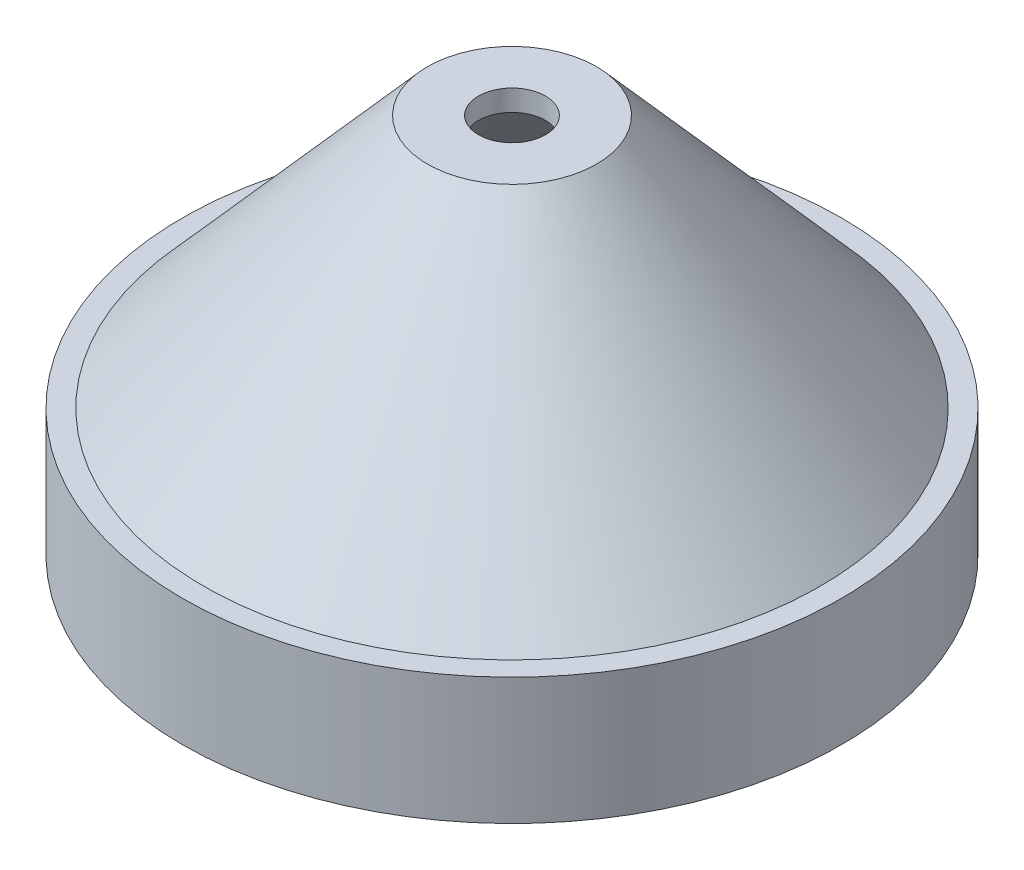
ISO-10303-21;
HEADER;
FILE_DESCRIPTION(('STEP AP214'),'2;1');
FILE_NAME('part.step','',(''),(''),'','','');
FILE_SCHEMA(('AUTOMOTIVE_DESIGN { 1 0 10303 214 1 1 1 1 }'));
ENDSEC;
DATA;
#1=APPLICATION_CONTEXT('core data for automotive mechanical design processes');
#2=APPLICATION_PROTOCOL_DEFINITION('international standard','automotive_design',2000,#1);
#3=PRODUCT_CONTEXT('',#1,'mechanical');
#4=PRODUCT('Part','Part','',(#3));
#5=PRODUCT_RELATED_PRODUCT_CATEGORY('part','',(#4));
#6=PRODUCT_DEFINITION_FORMATION('','',#4);
#7=PRODUCT_DEFINITION_CONTEXT('part definition',#1,'design');
#8=PRODUCT_DEFINITION('design','',#6,#7);
#9=PRODUCT_DEFINITION_SHAPE('','',#8);
#10=(LENGTH_UNIT() NAMED_UNIT(*) SI_UNIT(.MILLI.,.METRE.));
#11=(NAMED_UNIT(*) PLANE_ANGLE_UNIT() SI_UNIT($,.RADIAN.));
#12=(NAMED_UNIT(*) SI_UNIT($,.STERADIAN.) SOLID_ANGLE_UNIT());
#13=UNCERTAINTY_MEASURE_WITH_UNIT(LENGTH_MEASURE(1.E-05),#10,'distance_accuracy_value','');
#14=(GEOMETRIC_REPRESENTATION_CONTEXT(3) GLOBAL_UNCERTAINTY_ASSIGNED_CONTEXT((#13)) GLOBAL_UNIT_ASSIGNED_CONTEXT((#10,
#11,#12)) REPRESENTATION_CONTEXT('',''));
#15=CARTESIAN_POINT('',(0.,0.,0.));
#16=DIRECTION('',(0.,0.,1.));
#17=DIRECTION('',(1.,0.,0.));
#18=AXIS2_PLACEMENT_3D('',#15,#16,#17);
#19=CARTESIAN_POINT('',(49.53,19.05,0.));
#20=DIRECTION('',(0.,-1.,0.));
#21=DIRECTION('',(0.,0.,-1.));
#22=AXIS2_PLACEMENT_3D('',#19,#20,#21);
#23=PLANE('',#22);
#24=CARTESIAN_POINT('',(0.,19.05,0.));
#25=DIRECTION('',(0.,1.,0.));
#26=DIRECTION('',(0.,0.,1.));
#27=AXIS2_PLACEMENT_3D('',#24,#25,#26);
#28=CIRCLE('',#27,46.355);
#29=CARTESIAN_POINT('',(0.,19.05,-46.355));
#30=VERTEX_POINT('',#29);
#31=EDGE_CURVE('E46',#30,#30,#28,.T.);
#32=ORIENTED_EDGE('',*,*,#31,.F.);
#33=EDGE_LOOP('',(#32));
#34=FACE_BOUND('',#33,.T.);
#35=CARTESIAN_POINT('',(0.,19.05,0.));
#36=DIRECTION('',(0.,1.,0.));
#37=DIRECTION('',(0.,0.,1.));
#38=AXIS2_PLACEMENT_3D('',#35,#36,#37);
#39=CIRCLE('',#38,49.53);
#40=CARTESIAN_POINT('',(0.,19.05,-49.53));
#41=VERTEX_POINT('',#40);
#42=EDGE_CURVE('E42',#41,#41,#39,.T.);
#43=ORIENTED_EDGE('',*,*,#42,.T.);
#44=EDGE_LOOP('',(#43));
#45=FACE_BOUND('',#44,.T.);
#46=ADVANCED_FACE('F35',(#34,#45),#23,.F.);
#47=CARTESIAN_POINT('',(0.,19.05,0.));
#48=DIRECTION('',(0.,-1.,0.));
#49=DIRECTION('',(0.,0.,-1.));
#50=AXIS2_PLACEMENT_3D('',#47,#48,#49);
#51=CONICAL_SURFACE('',#50,46.355,0.723530317533068);
#52=CARTESIAN_POINT('',(0.,57.15,0.));
#53=DIRECTION('',(0.,1.,0.));
#54=DIRECTION('',(0.,0.,1.));
#55=AXIS2_PLACEMENT_3D('',#52,#53,#54);
#56=CIRCLE('',#55,12.7);
#57=CARTESIAN_POINT('',(0.,57.15,-12.7));
#58=VERTEX_POINT('',#57);
#59=EDGE_CURVE('E50',#58,#58,#56,.T.);
#60=CARTESIAN_POINT('',(0.,57.15,-12.7));
#61=CARTESIAN_POINT('',(0.,56.753125,-13.0505729166667));
#62=CARTESIAN_POINT('',(0.,56.35625,-13.4011458333333));
#63=CARTESIAN_POINT('',(0.,55.5625,-14.1022916666667));
#64=CARTESIAN_POINT('',(0.,55.165625,-14.4528645833333));
#65=CARTESIAN_POINT('',(0.,54.371875,-15.1540104166667));
#66=CARTESIAN_POINT('',(0.,53.975,-15.5045833333333));
#67=CARTESIAN_POINT('',(0.,53.18125,-16.2057291666667));
#68=CARTESIAN_POINT('',(0.,52.784375,-16.5563020833333));
#69=CARTESIAN_POINT('',(0.,51.990625,-17.2574479166667));
#70=CARTESIAN_POINT('',(0.,51.59375,-17.6080208333333));
#71=CARTESIAN_POINT('',(0.,50.8,-18.3091666666667));
#72=CARTESIAN_POINT('',(0.,50.403125,-18.6597395833333));
#73=CARTESIAN_POINT('',(0.,49.609375,-19.3608854166667));
#74=CARTESIAN_POINT('',(0.,49.2125,-19.7114583333333));
#75=CARTESIAN_POINT('',(0.,48.41875,-20.4126041666667));
#76=CARTESIAN_POINT('',(0.,48.021875,-20.7631770833333));
#77=CARTESIAN_POINT('',(0.,47.228125,-21.4643229166667));
#78=CARTESIAN_POINT('',(0.,46.83125,-21.8148958333333));
#79=CARTESIAN_POINT('',(0.,46.0375,-22.5160416666667));
#80=CARTESIAN_POINT('',(0.,45.640625,-22.8666145833333));
#81=CARTESIAN_POINT('',(0.,44.846875,-23.5677604166667));
#82=CARTESIAN_POINT('',(0.,44.45,-23.9183333333333));
#83=CARTESIAN_POINT('',(0.,43.65625,-24.6194791666667));
#84=CARTESIAN_POINT('',(0.,43.259375,-24.9700520833333));
#85=CARTESIAN_POINT('',(0.,42.465625,-25.6711979166667));
#86=CARTESIAN_POINT('',(0.,42.06875,-26.0217708333333));
#87=CARTESIAN_POINT('',(0.,41.275,-26.7229166666667));
#88=CARTESIAN_POINT('',(0.,40.878125,-27.0734895833333));
#89=CARTESIAN_POINT('',(0.,40.084375,-27.7746354166667));
#90=CARTESIAN_POINT('',(0.,39.6875,-28.1252083333333));
#91=CARTESIAN_POINT('',(0.,38.89375,-28.8263541666667));
#92=CARTESIAN_POINT('',(0.,38.496875,-29.1769270833333));
#93=CARTESIAN_POINT('',(0.,37.703125,-29.8780729166667));
#94=CARTESIAN_POINT('',(0.,37.30625,-30.2286458333333));
#95=CARTESIAN_POINT('',(0.,36.5125,-30.9297916666667));
#96=CARTESIAN_POINT('',(0.,36.115625,-31.2803645833333));
#97=CARTESIAN_POINT('',(0.,35.321875,-31.9815104166667));
#98=CARTESIAN_POINT('',(0.,34.925,-32.3320833333333));
#99=CARTESIAN_POINT('',(0.,34.13125,-33.0332291666667));
#100=CARTESIAN_POINT('',(0.,33.734375,-33.3838020833333));
#101=CARTESIAN_POINT('',(0.,32.940625,-34.0849479166667));
#102=CARTESIAN_POINT('',(0.,32.54375,-34.4355208333333));
#103=CARTESIAN_POINT('',(0.,31.75,-35.1366666666667));
#104=CARTESIAN_POINT('',(0.,31.353125,-35.4872395833333));
#105=CARTESIAN_POINT('',(0.,30.559375,-36.1883854166667));
#106=CARTESIAN_POINT('',(0.,30.1625,-36.5389583333333));
#107=CARTESIAN_POINT('',(0.,29.36875,-37.2401041666667));
#108=CARTESIAN_POINT('',(0.,28.971875,-37.5906770833333));
#109=CARTESIAN_POINT('',(0.,28.178125,-38.2918229166667));
#110=CARTESIAN_POINT('',(0.,27.78125,-38.6423958333333));
#111=CARTESIAN_POINT('',(0.,26.9875,-39.3435416666667));
#112=CARTESIAN_POINT('',(0.,26.590625,-39.6941145833333));
#113=CARTESIAN_POINT('',(0.,25.796875,-40.3952604166667));
#114=CARTESIAN_POINT('',(0.,25.4,-40.7458333333333));
#115=CARTESIAN_POINT('',(0.,24.60625,-41.4469791666667));
#116=CARTESIAN_POINT('',(0.,24.209375,-41.7975520833333));
#117=CARTESIAN_POINT('',(0.,23.415625,-42.4986979166667));
#118=CARTESIAN_POINT('',(0.,23.01875,-42.8492708333333));
#119=CARTESIAN_POINT('',(0.,22.225,-43.5504166666667));
#120=CARTESIAN_POINT('',(0.,21.828125,-43.9009895833333));
#121=CARTESIAN_POINT('',(0.,21.034375,-44.6021354166667));
#122=CARTESIAN_POINT('',(0.,20.6375,-44.9527083333333));
#123=CARTESIAN_POINT('',(0.,19.84375,-45.6538541666667));
#124=CARTESIAN_POINT('',(0.,19.446875,-46.0044270833333));
#125=CARTESIAN_POINT('',(0.,19.05,-46.355));
#126=B_SPLINE_CURVE_WITH_KNOTS('',3,(#60,#61,#62,#63,#64,#65,#66,#67,#68,#69,#70,#71,#72,#73,
#74,#75,#76,#77,#78,#79,#80,#81,#82,#83,#84,#85,#86,#87,#88,#89,#90,#91,#92,#93,#94,#95,#96,#97,
#98,#99,#100,#101,#102,#103,#104,#105,#106,#107,#108,#109,#110,#111,#112,#113,#114,#115,#116,
#117,#118,#119,#120,#121,#122,#123,#124,#125),.UNSPECIFIED.,.F.,.F.,(4,2,2,2,2,2,2,2,2,2,2,2,2,
2,2,2,2,2,2,2,2,2,2,2,2,2,2,2,2,2,2,2,4),(0.,1.58861581879527,3.17723163759054,4.76584745638581,
6.35446327518108,7.94307909397634,9.53169491277161,11.1203107315669,12.7089265503622,
14.2975423691574,15.8861581879527,17.474774006748,19.0633898255432,20.6520056443385,
22.2406214631338,23.829237281929,25.4178531007243,27.0064689195196,28.5950847383148,
30.1837005571101,31.7723163759054,33.3609321947007,34.9495480134959,36.5381638322912,
38.1267796510865,39.7153954698817,41.304011288677,42.8926271074723,44.4812429262675,
46.0698587450628,47.6584745638581,49.2470903826533,50.8357062014486),.UNSPECIFIED.);
#127=EDGE_CURVE('BSEAM79',#58,#30,#126,.T.);
#128=ORIENTED_EDGE('',*,*,#59,.F.);
#129=ORIENTED_EDGE('',*,*,#31,.T.);
#130=ORIENTED_EDGE('',*,*,#127,.T.);
#131=ORIENTED_EDGE('',*,*,#127,.F.);
#132=EDGE_LOOP('',(#128,#130,#129,#131));
#133=FACE_BOUND('',#132,.T.);
#134=ADVANCED_FACE('F79',(#133),#51,.T.);
#135=CARTESIAN_POINT('',(12.7,57.15,0.));
#136=DIRECTION('',(0.,-1.,0.));
#137=DIRECTION('',(0.,0.,-1.));
#138=AXIS2_PLACEMENT_3D('',#135,#136,#137);
#139=PLANE('',#138);
#140=CARTESIAN_POINT('',(0.,57.15,0.));
#141=DIRECTION('',(0.,1.,0.));
#142=DIRECTION('',(0.,0.,1.));
#143=AXIS2_PLACEMENT_3D('',#140,#141,#142);
#144=CIRCLE('',#143,5.0419);
#145=CARTESIAN_POINT('',(0.,57.15,5.0419));
#146=VERTEX_POINT('',#145);
#147=EDGE_CURVE('E70',#146,#146,#144,.T.);
#148=ORIENTED_EDGE('',*,*,#147,.F.);
#149=EDGE_LOOP('',(#148));
#150=FACE_BOUND('',#149,.T.);
#151=ORIENTED_EDGE('',*,*,#59,.T.);
#152=EDGE_LOOP('',(#151));
#153=FACE_BOUND('',#152,.T.);
#154=ADVANCED_FACE('F76',(#150,#153),#139,.F.);
#155=CARTESIAN_POINT('',(0.,76.2,0.));
#156=DIRECTION('',(0.,-1.,0.));
#157=DIRECTION('',(0.,0.,-1.));
#158=AXIS2_PLACEMENT_3D('',#155,#156,#157);
#159=CYLINDRICAL_SURFACE('',#158,49.53);
#160=CARTESIAN_POINT('',(0.,0.,0.));
#161=DIRECTION('',(0.,1.,0.));
#162=DIRECTION('',(0.,0.,1.));
#163=AXIS2_PLACEMENT_3D('',#160,#161,#162);
#164=CIRCLE('',#163,49.53);
#165=CARTESIAN_POINT('',(0.,0.,-49.53));
#166=VERTEX_POINT('',#165);
#167=EDGE_CURVE('E10',#166,#166,#164,.T.);
#168=CARTESIAN_POINT('',(0.,19.05,-49.53));
#169=CARTESIAN_POINT('',(0.,18.8515625,-49.53));
#170=CARTESIAN_POINT('',(0.,18.653125,-49.53));
#171=CARTESIAN_POINT('',(0.,18.25625,-49.53));
#172=CARTESIAN_POINT('',(0.,18.0578125,-49.53));
#173=CARTESIAN_POINT('',(0.,17.6609375,-49.53));
#174=CARTESIAN_POINT('',(0.,17.4625,-49.53));
#175=CARTESIAN_POINT('',(0.,17.065625,-49.53));
#176=CARTESIAN_POINT('',(0.,16.8671875,-49.53));
#177=CARTESIAN_POINT('',(0.,16.4703125,-49.53));
#178=CARTESIAN_POINT('',(0.,16.271875,-49.53));
#179=CARTESIAN_POINT('',(0.,15.875,-49.53));
#180=CARTESIAN_POINT('',(0.,15.6765625,-49.53));
#181=CARTESIAN_POINT('',(0.,15.2796875,-49.53));
#182=CARTESIAN_POINT('',(0.,15.08125,-49.53));
#183=CARTESIAN_POINT('',(0.,14.684375,-49.53));
#184=CARTESIAN_POINT('',(0.,14.4859375,-49.53));
#185=CARTESIAN_POINT('',(0.,14.0890625,-49.53));
#186=CARTESIAN_POINT('',(0.,13.890625,-49.53));
#187=CARTESIAN_POINT('',(0.,13.49375,-49.53));
#188=CARTESIAN_POINT('',(0.,13.2953125,-49.53));
#189=CARTESIAN_POINT('',(0.,12.8984375,-49.53));
#190=CARTESIAN_POINT('',(0.,12.7,-49.53));
#191=CARTESIAN_POINT('',(0.,12.303125,-49.53));
#192=CARTESIAN_POINT('',(0.,12.1046875,-49.53));
#193=CARTESIAN_POINT('',(0.,11.7078125,-49.53));
#194=CARTESIAN_POINT('',(0.,11.509375,-49.53));
#195=CARTESIAN_POINT('',(0.,11.1125,-49.53));
#196=CARTESIAN_POINT('',(0.,10.9140625,-49.53));
#197=CARTESIAN_POINT('',(0.,10.5171875,-49.53));
#198=CARTESIAN_POINT('',(0.,10.31875,-49.53));
#199=CARTESIAN_POINT('',(0.,9.92187500000001,-49.53));
#200=CARTESIAN_POINT('',(0.,9.72343750000001,-49.53));
#201=CARTESIAN_POINT('',(0.,9.3265625,-49.53));
#202=CARTESIAN_POINT('',(0.,9.12812500000001,-49.53));
#203=CARTESIAN_POINT('',(0.,8.73125,-49.53));
#204=CARTESIAN_POINT('',(0.,8.53281250000001,-49.53));
#205=CARTESIAN_POINT('',(0.,8.1359375,-49.53));
#206=CARTESIAN_POINT('',(0.,7.93750000000001,-49.53));
#207=CARTESIAN_POINT('',(0.,7.540625,-49.53));
#208=CARTESIAN_POINT('',(0.,7.3421875,-49.53));
#209=CARTESIAN_POINT('',(0.,6.9453125,-49.53));
#210=CARTESIAN_POINT('',(0.,6.746875,-49.53));
#211=CARTESIAN_POINT('',(0.,6.35,-49.53));
#212=CARTESIAN_POINT('',(0.,6.1515625,-49.53));
#213=CARTESIAN_POINT('',(0.,5.7546875,-49.53));
#214=CARTESIAN_POINT('',(0.,5.55625,-49.53));
#215=CARTESIAN_POINT('',(0.,5.159375,-49.53));
#216=CARTESIAN_POINT('',(0.,4.9609375,-49.53));
#217=CARTESIAN_POINT('',(0.,4.5640625,-49.53));
#218=CARTESIAN_POINT('',(0.,4.365625,-49.53));
#219=CARTESIAN_POINT('',(0.,3.96875,-49.53));
#220=CARTESIAN_POINT('',(0.,3.7703125,-49.53));
#221=CARTESIAN_POINT('',(0.,3.3734375,-49.53));
#222=CARTESIAN_POINT('',(0.,3.175,-49.53));
#223=CARTESIAN_POINT('',(0.,2.778125,-49.53));
#224=CARTESIAN_POINT('',(0.,2.5796875,-49.53));
#225=CARTESIAN_POINT('',(0.,2.1828125,-49.53));
#226=CARTESIAN_POINT('',(0.,1.984375,-49.53));
#227=CARTESIAN_POINT('',(0.,1.5875,-49.53));
#228=CARTESIAN_POINT('',(0.,1.3890625,-49.53));
#229=CARTESIAN_POINT('',(0.,0.992187500000001,-49.53));
#230=CARTESIAN_POINT('',(0.,0.793750000000001,-49.53));
#231=CARTESIAN_POINT('',(0.,0.396875,-49.53));
#232=CARTESIAN_POINT('',(0.,0.1984375,-49.53));
#233=CARTESIAN_POINT('',(0.,0.,-49.53));
#234=B_SPLINE_CURVE_WITH_KNOTS('',3,(#168,#169,#170,#171,#172,#173,#174,#175,#176,#177,#178,
#179,#180,#181,#182,#183,#184,#185,#186,#187,#188,#189,#190,#191,#192,#193,#194,#195,#196,#197,
#198,#199,#200,#201,#202,#203,#204,#205,#206,#207,#208,#209,#210,#211,#212,#213,#214,#215,#216,
#217,#218,#219,#220,#221,#222,#223,#224,#225,#226,#227,#228,#229,#230,#231,#232,#233),
.UNSPECIFIED.,.F.,.F.,(4,2,2,2,2,2,2,2,2,2,2,2,2,2,2,2,2,2,2,2,2,2,2,2,2,2,2,2,2,2,2,2,4),(0.,
0.5953125,1.190625,1.7859375,2.38125,2.9765625,3.571875,4.1671875,4.7625,5.3578125,5.953125,
6.5484375,7.14375,7.7390625,8.33437499999998,8.92968749999998,9.52499999999998,10.1203125,
10.715625,11.3109375,11.90625,12.5015625,13.096875,13.6921875,14.2875,14.8828125,15.478125,
16.0734375,16.66875,17.2640625,17.859375,18.4546875,19.05),.UNSPECIFIED.);
#235=EDGE_CURVE('BSEAM37',#41,#166,#234,.T.);
#236=ORIENTED_EDGE('',*,*,#42,.F.);
#237=ORIENTED_EDGE('',*,*,#167,.T.);
#238=ORIENTED_EDGE('',*,*,#235,.T.);
#239=ORIENTED_EDGE('',*,*,#235,.F.);
#240=EDGE_LOOP('',(#236,#238,#237,#239));
#241=FACE_BOUND('',#240,.T.);
#242=ADVANCED_FACE('F37',(#241),#159,.T.);
#243=CARTESIAN_POINT('',(0.,0.,0.));
#244=DIRECTION('',(0.,1.,0.));
#245=DIRECTION('',(0.,0.,1.));
#246=AXIS2_PLACEMENT_3D('',#243,#244,#245);
#247=PLANE('',#246);
#248=CARTESIAN_POINT('',(0.,0.,0.));
#249=DIRECTION('',(0.,1.,0.));
#250=DIRECTION('',(0.,0.,1.));
#251=AXIS2_PLACEMENT_3D('',#248,#249,#250);
#252=CIRCLE('',#251,46.355);
#253=CARTESIAN_POINT('',(0.,0.,-46.355));
#254=VERTEX_POINT('',#253);
#255=EDGE_CURVE('E55',#254,#254,#252,.T.);
#256=ORIENTED_EDGE('',*,*,#255,.T.);
#257=EDGE_LOOP('',(#256));
#258=FACE_BOUND('',#257,.T.);
#259=ORIENTED_EDGE('',*,*,#167,.F.);
#260=EDGE_LOOP('',(#259));
#261=FACE_BOUND('',#260,.T.);
#262=ADVANCED_FACE('F92',(#258,#261),#247,.F.);
#263=CARTESIAN_POINT('',(49.53,15.875,0.));
#264=DIRECTION('',(0.,-1.,0.));
#265=DIRECTION('',(0.,0.,-1.));
#266=AXIS2_PLACEMENT_3D('',#263,#264,#265);
#267=PLANE('',#266);
#268=CARTESIAN_POINT('',(0.,15.875,0.));
#269=DIRECTION('',(0.,-1.,0.));
#270=DIRECTION('',(0.,0.,-1.));
#271=AXIS2_PLACEMENT_3D('',#268,#269,#270);
#272=CIRCLE('',#271,44.9232744832126);
#273=CARTESIAN_POINT('',(0.,15.875,-44.9232744832126));
#274=VERTEX_POINT('',#273);
#275=EDGE_CURVE('E62',#274,#274,#272,.F.);
#276=ORIENTED_EDGE('',*,*,#275,.T.);
#277=EDGE_LOOP('',(#276));
#278=FACE_BOUND('',#277,.T.);
#279=CARTESIAN_POINT('',(0.,15.875,0.));
#280=DIRECTION('',(0.,-1.,0.));
#281=DIRECTION('',(0.,0.,-1.));
#282=AXIS2_PLACEMENT_3D('',#279,#280,#281);
#283=CIRCLE('',#282,46.355);
#284=CARTESIAN_POINT('',(0.,15.875,-46.355));
#285=VERTEX_POINT('',#284);
#286=EDGE_CURVE('E58',#285,#285,#283,.F.);
#287=ORIENTED_EDGE('',*,*,#286,.F.);
#288=EDGE_LOOP('',(#287));
#289=FACE_BOUND('',#288,.T.);
#290=ADVANCED_FACE('F94',(#278,#289),#267,.T.);
#291=CARTESIAN_POINT('',(0.,16.9480399214567,0.));
#292=DIRECTION('',(0.,-1.,0.));
#293=DIRECTION('',(0.,0.,-1.));
#294=AXIS2_PLACEMENT_3D('',#291,#292,#293);
#295=CONICAL_SURFACE('',#294,43.9754225525925,0.723530317533068);
#296=CARTESIAN_POINT('',(0.,53.975,0.));
#297=DIRECTION('',(0.,-1.,0.));
#298=DIRECTION('',(0.,0.,-1.));
#299=AXIS2_PLACEMENT_3D('',#296,#297,#298);
#300=CIRCLE('',#299,11.2682744832126);
#301=CARTESIAN_POINT('',(0.,53.975,-11.2682744832126));
#302=VERTEX_POINT('',#301);
#303=EDGE_CURVE('E59',#302,#302,#300,.F.);
#304=CARTESIAN_POINT('',(0.,53.975,-11.2682744832126));
#305=CARTESIAN_POINT('',(0.,53.578125,-11.6188473998793));
#306=CARTESIAN_POINT('',(0.,53.18125,-11.9694203165459));
#307=CARTESIAN_POINT('',(0.,52.3875,-12.6705661498793));
#308=CARTESIAN_POINT('',(0.,51.990625,-13.021139066546));
#309=CARTESIAN_POINT('',(0.,51.196875,-13.7222848998793));
#310=CARTESIAN_POINT('',(0.,50.8,-14.072857816546));
#311=CARTESIAN_POINT('',(0.,50.00625,-14.7740036498793));
#312=CARTESIAN_POINT('',(0.,49.609375,-15.124576566546));
#313=CARTESIAN_POINT('',(0.,48.815625,-15.8257223998793));
#314=CARTESIAN_POINT('',(0.,48.41875,-16.1762953165459));
#315=CARTESIAN_POINT('',(0.,47.625,-16.8774411498793));
#316=CARTESIAN_POINT('',(0.,47.228125,-17.2280140665459));
#317=CARTESIAN_POINT('',(0.,46.434375,-17.9291598998793));
#318=CARTESIAN_POINT('',(0.,46.0375,-18.2797328165459));
#319=CARTESIAN_POINT('',(0.,45.24375,-18.9808786498793));
#320=CARTESIAN_POINT('',(0.,44.846875,-19.3314515665459));
#321=CARTESIAN_POINT('',(0.,44.053125,-20.0325973998793));
#322=CARTESIAN_POINT('',(0.,43.65625,-20.3831703165459));
#323=CARTESIAN_POINT('',(0.,42.8625,-21.0843161498793));
#324=CARTESIAN_POINT('',(0.,42.465625,-21.434889066546));
#325=CARTESIAN_POINT('',(0.,41.671875,-22.1360348998793));
#326=CARTESIAN_POINT('',(0.,41.275,-22.486607816546));
#327=CARTESIAN_POINT('',(0.,40.48125,-23.1877536498793));
#328=CARTESIAN_POINT('',(0.,40.084375,-23.538326566546));
#329=CARTESIAN_POINT('',(0.,39.290625,-24.2394723998793));
#330=CARTESIAN_POINT('',(0.,38.89375,-24.590045316546));
#331=CARTESIAN_POINT('',(0.,38.1,-25.2911911498793));
#332=CARTESIAN_POINT('',(0.,37.703125,-25.6417640665459));
#333=CARTESIAN_POINT('',(0.,36.909375,-26.3429098998793));
#334=CARTESIAN_POINT('',(0.,36.5125,-26.6934828165459));
#335=CARTESIAN_POINT('',(0.,35.71875,-27.3946286498793));
#336=CARTESIAN_POINT('',(0.,35.321875,-27.745201566546));
#337=CARTESIAN_POINT('',(0.,34.528125,-28.4463473998793));
#338=CARTESIAN_POINT('',(0.,34.13125,-28.796920316546));
#339=CARTESIAN_POINT('',(0.,33.3375,-29.4980661498793));
#340=CARTESIAN_POINT('',(0.,32.940625,-29.848639066546));
#341=CARTESIAN_POINT('',(0.,32.146875,-30.5497848998793));
#342=CARTESIAN_POINT('',(0.,31.75,-30.9003578165459));
#343=CARTESIAN_POINT('',(0.,30.95625,-31.6015036498793));
#344=CARTESIAN_POINT('',(0.,30.559375,-31.952076566546));
#345=CARTESIAN_POINT('',(0.,29.765625,-32.6532223998793));
#346=CARTESIAN_POINT('',(0.,29.36875,-33.003795316546));
#347=CARTESIAN_POINT('',(0.,28.575,-33.7049411498793));
#348=CARTESIAN_POINT('',(0.,28.178125,-34.055514066546));
#349=CARTESIAN_POINT('',(0.,27.384375,-34.7566598998793));
#350=CARTESIAN_POINT('',(0.,26.9875,-35.107232816546));
#351=CARTESIAN_POINT('',(0.,26.19375,-35.8083786498793));
#352=CARTESIAN_POINT('',(0.,25.796875,-36.158951566546));
#353=CARTESIAN_POINT('',(0.,25.003125,-36.8600973998793));
#354=CARTESIAN_POINT('',(0.,24.60625,-37.210670316546));
#355=CARTESIAN_POINT('',(0.,23.8125,-37.9118161498793));
#356=CARTESIAN_POINT('',(0.,23.415625,-38.2623890665459));
#357=CARTESIAN_POINT('',(0.,22.621875,-38.9635348998793));
#358=CARTESIAN_POINT('',(0.,22.225,-39.3141078165459));
#359=CARTESIAN_POINT('',(0.,21.43125,-40.0152536498793));
#360=CARTESIAN_POINT('',(0.,21.034375,-40.3658265665459));
#361=CARTESIAN_POINT('',(0.,20.240625,-41.0669723998793));
#362=CARTESIAN_POINT('',(0.,19.84375,-41.4175453165459));
#363=CARTESIAN_POINT('',(0.,19.05,-42.1186911498793));
#364=CARTESIAN_POINT('',(0.,18.653125,-42.4692640665459));
#365=CARTESIAN_POINT('',(0.,17.859375,-43.1704098998793));
#366=CARTESIAN_POINT('',(0.,17.4625,-43.5209828165459));
#367=CARTESIAN_POINT('',(0.,16.66875,-44.2221286498793));
#368=CARTESIAN_POINT('',(0.,16.271875,-44.572701566546));
#369=CARTESIAN_POINT('',(0.,15.875,-44.9232744832126));
#370=B_SPLINE_CURVE_WITH_KNOTS('',3,(#304,#305,#306,#307,#308,#309,#310,#311,#312,#313,#314,
#315,#316,#317,#318,#319,#320,#321,#322,#323,#324,#325,#326,#327,#328,#329,#330,#331,#332,#333,
#334,#335,#336,#337,#338,#339,#340,#341,#342,#343,#344,#345,#346,#347,#348,#349,#350,#351,#352,
#353,#354,#355,#356,#357,#358,#359,#360,#361,#362,#363,#364,#365,#366,#367,#368,#369),
.UNSPECIFIED.,.F.,.F.,(4,2,2,2,2,2,2,2,2,2,2,2,2,2,2,2,2,2,2,2,2,2,2,2,2,2,2,2,2,2,2,2,4),(0.,
1.58861581879527,3.17723163759054,4.76584745638581,6.35446327518108,7.94307909397634,
9.53169491277161,11.1203107315669,12.7089265503621,14.2975423691574,15.8861581879527,
17.474774006748,19.0633898255432,20.6520056443385,22.2406214631338,23.829237281929,
25.4178531007243,27.0064689195196,28.5950847383148,30.1837005571101,31.7723163759054,
33.3609321947006,34.9495480134959,36.5381638322912,38.1267796510865,39.7153954698817,
41.304011288677,42.8926271074723,44.4812429262675,46.0698587450628,47.6584745638581,
49.2470903826533,50.8357062014486),.UNSPECIFIED.);
#371=EDGE_CURVE('BSEAM100',#302,#274,#370,.T.);
#372=ORIENTED_EDGE('',*,*,#303,.T.);
#373=ORIENTED_EDGE('',*,*,#275,.F.);
#374=ORIENTED_EDGE('',*,*,#371,.T.);
#375=ORIENTED_EDGE('',*,*,#371,.F.);
#376=EDGE_LOOP('',(#372,#374,#373,#375));
#377=FACE_BOUND('',#376,.T.);
#378=ADVANCED_FACE('F100',(#377),#295,.F.);
#379=CARTESIAN_POINT('',(12.7,53.975,0.));
#380=DIRECTION('',(0.,-1.,0.));
#381=DIRECTION('',(0.,0.,-1.));
#382=AXIS2_PLACEMENT_3D('',#379,#380,#381);
#383=PLANE('',#382);
#384=CARTESIAN_POINT('',(0.,53.975,0.));
#385=DIRECTION('',(0.,-1.,0.));
#386=DIRECTION('',(0.,0.,-1.));
#387=AXIS2_PLACEMENT_3D('',#384,#385,#386);
#388=CIRCLE('',#387,5.04189999999999);
#389=CARTESIAN_POINT('',(0.,53.975,-5.04189999999999));
#390=VERTEX_POINT('',#389);
#391=EDGE_CURVE('E63',#390,#390,#388,.T.);
#392=ORIENTED_EDGE('',*,*,#391,.F.);
#393=EDGE_LOOP('',(#392));
#394=FACE_BOUND('',#393,.T.);
#395=ORIENTED_EDGE('',*,*,#303,.F.);
#396=EDGE_LOOP('',(#395));
#397=FACE_BOUND('',#396,.T.);
#398=ADVANCED_FACE('F109',(#394,#397),#383,.T.);
#399=CARTESIAN_POINT('',(0.,76.2,0.));
#400=DIRECTION('',(0.,-1.,0.));
#401=DIRECTION('',(0.,0.,-1.));
#402=AXIS2_PLACEMENT_3D('',#399,#400,#401);
#403=CYLINDRICAL_SURFACE('',#402,46.355);
#404=CARTESIAN_POINT('',(0.,15.875,-46.355));
#405=CARTESIAN_POINT('',(0.,15.7096354166667,-46.355));
#406=CARTESIAN_POINT('',(0.,15.5442708333333,-46.355));
#407=CARTESIAN_POINT('',(0.,15.2135416666667,-46.355));
#408=CARTESIAN_POINT('',(0.,15.0481770833333,-46.355));
#409=CARTESIAN_POINT('',(0.,14.7174479166667,-46.355));
#410=CARTESIAN_POINT('',(0.,14.5520833333333,-46.355));
#411=CARTESIAN_POINT('',(0.,14.2213541666667,-46.355));
#412=CARTESIAN_POINT('',(0.,14.0559895833333,-46.355));
#413=CARTESIAN_POINT('',(0.,13.7252604166667,-46.355));
#414=CARTESIAN_POINT('',(0.,13.5598958333333,-46.355));
#415=CARTESIAN_POINT('',(0.,13.2291666666667,-46.355));
#416=CARTESIAN_POINT('',(0.,13.0638020833333,-46.355));
#417=CARTESIAN_POINT('',(0.,12.7330729166667,-46.355));
#418=CARTESIAN_POINT('',(0.,12.5677083333333,-46.355));
#419=CARTESIAN_POINT('',(0.,12.2369791666667,-46.355));
#420=CARTESIAN_POINT('',(0.,12.0716145833333,-46.355));
#421=CARTESIAN_POINT('',(0.,11.7408854166667,-46.355));
#422=CARTESIAN_POINT('',(0.,11.5755208333333,-46.355));
#423=CARTESIAN_POINT('',(0.,11.2447916666667,-46.355));
#424=CARTESIAN_POINT('',(0.,11.0794270833333,-46.355));
#425=CARTESIAN_POINT('',(0.,10.7486979166667,-46.355));
#426=CARTESIAN_POINT('',(0.,10.5833333333333,-46.355));
#427=CARTESIAN_POINT('',(0.,10.2526041666667,-46.355));
#428=CARTESIAN_POINT('',(0.,10.0872395833333,-46.355));
#429=CARTESIAN_POINT('',(0.,9.75651041666668,-46.355));
#430=CARTESIAN_POINT('',(0.,9.59114583333335,-46.355));
#431=CARTESIAN_POINT('',(0.,9.26041666666668,-46.355));
#432=CARTESIAN_POINT('',(0.,9.09505208333334,-46.355));
#433=CARTESIAN_POINT('',(0.,8.76432291666667,-46.355));
#434=CARTESIAN_POINT('',(0.,8.59895833333334,-46.355));
#435=CARTESIAN_POINT('',(0.,8.26822916666668,-46.355));
#436=CARTESIAN_POINT('',(0.,8.10286458333335,-46.355));
#437=CARTESIAN_POINT('',(0.,7.77213541666668,-46.355));
#438=CARTESIAN_POINT('',(0.,7.60677083333334,-46.355));
#439=CARTESIAN_POINT('',(0.,7.27604166666667,-46.355));
#440=CARTESIAN_POINT('',(0.,7.11067708333334,-46.355));
#441=CARTESIAN_POINT('',(0.,6.77994791666668,-46.355));
#442=CARTESIAN_POINT('',(0.,6.61458333333334,-46.355));
#443=CARTESIAN_POINT('',(0.,6.28385416666668,-46.355));
#444=CARTESIAN_POINT('',(0.,6.11848958333334,-46.355));
#445=CARTESIAN_POINT('',(0.,5.78776041666667,-46.355));
#446=CARTESIAN_POINT('',(0.,5.62239583333334,-46.355));
#447=CARTESIAN_POINT('',(0.,5.29166666666668,-46.355));
#448=CARTESIAN_POINT('',(0.,5.12630208333334,-46.355));
#449=CARTESIAN_POINT('',(0.,4.79557291666668,-46.355));
#450=CARTESIAN_POINT('',(0.,4.63020833333334,-46.355));
#451=CARTESIAN_POINT('',(0.,4.29947916666667,-46.355));
#452=CARTESIAN_POINT('',(0.,4.13411458333334,-46.355));
#453=CARTESIAN_POINT('',(0.,3.80338541666667,-46.355));
#454=CARTESIAN_POINT('',(0.,3.63802083333333,-46.355));
#455=CARTESIAN_POINT('',(0.,3.30729166666667,-46.355));
#456=CARTESIAN_POINT('',(0.,3.14192708333333,-46.355));
#457=CARTESIAN_POINT('',(0.,2.81119791666667,-46.355));
#458=CARTESIAN_POINT('',(0.,2.64583333333334,-46.355));
#459=CARTESIAN_POINT('',(0.,2.31510416666667,-46.355));
#460=CARTESIAN_POINT('',(0.,2.14973958333333,-46.355));
#461=CARTESIAN_POINT('',(0.,1.81901041666666,-46.355));
#462=CARTESIAN_POINT('',(0.,1.65364583333333,-46.355));
#463=CARTESIAN_POINT('',(0.,1.32291666666667,-46.355));
#464=CARTESIAN_POINT('',(0.,1.15755208333334,-46.355));
#465=CARTESIAN_POINT('',(0.,0.826822916666669,-46.355));
#466=CARTESIAN_POINT('',(0.,0.661458333333332,-46.355));
#467=CARTESIAN_POINT('',(0.,0.330729166666664,-46.355));
#468=CARTESIAN_POINT('',(0.,0.165364583333332,-46.355));
#469=CARTESIAN_POINT('',(0.,0.,-46.355));
#470=B_SPLINE_CURVE_WITH_KNOTS('',3,(#404,#405,#406,#407,#408,#409,#410,#411,#412,#413,#414,
#415,#416,#417,#418,#419,#420,#421,#422,#423,#424,#425,#426,#427,#428,#429,#430,#431,#432,#433,
#434,#435,#436,#437,#438,#439,#440,#441,#442,#443,#444,#445,#446,#447,#448,#449,#450,#451,#452,
#453,#454,#455,#456,#457,#458,#459,#460,#461,#462,#463,#464,#465,#466,#467,#468,#469),
.UNSPECIFIED.,.F.,.F.,(4,2,2,2,2,2,2,2,2,2,2,2,2,2,2,2,2,2,2,2,2,2,2,2,2,2,2,2,2,2,2,2,4),(0.,
0.496093750000003,0.992187499999998,1.48828125,1.984375,2.48046875,2.97656249999999,
3.47265624999999,3.96875,4.46484375,4.96093749999999,5.45703125,5.953125,6.44921874999999,
6.9453125,7.44140625,7.93749999999999,8.43359375,8.9296875,9.42578124999999,9.921875,
10.41796875,10.9140625,11.41015625,11.90625,12.40234375,12.8984375,13.39453125,13.890625,
14.38671875,14.8828125,15.37890625,15.875),.UNSPECIFIED.);
#471=EDGE_CURVE('BSEAM107',#285,#254,#470,.T.);
#472=ORIENTED_EDGE('',*,*,#286,.T.);
#473=ORIENTED_EDGE('',*,*,#255,.F.);
#474=ORIENTED_EDGE('',*,*,#471,.T.);
#475=ORIENTED_EDGE('',*,*,#471,.F.);
#476=EDGE_LOOP('',(#472,#474,#473,#475));
#477=FACE_BOUND('',#476,.T.);
#478=ADVANCED_FACE('F107',(#477),#403,.F.);
#479=CARTESIAN_POINT('',(0.,57.15,0.));
#480=DIRECTION('',(0.,1.,0.));
#481=DIRECTION('',(0.,0.,1.));
#482=AXIS2_PLACEMENT_3D('',#479,#480,#481);
#483=CYLINDRICAL_SURFACE('',#482,5.04189999999999);
#484=ORIENTED_EDGE('',*,*,#391,.T.);
#485=EDGE_LOOP('',(#484));
#486=FACE_BOUND('',#485,.T.);
#487=ORIENTED_EDGE('',*,*,#147,.T.);
#488=EDGE_LOOP('',(#487));
#489=FACE_BOUND('',#488,.T.);
#490=ADVANCED_FACE('F74',(#486,#489),#483,.F.);
#491=CLOSED_SHELL('',(#46,#134,#154,#242,#262,#290,#378,#398,#478,#490));
#492=MANIFOLD_SOLID_BREP('B2',#491);
#493=ADVANCED_BREP_SHAPE_REPRESENTATION('',(#18,#492),#14);
#494=SHAPE_DEFINITION_REPRESENTATION(#9,#493);
ENDSEC;
END-ISO-10303-21;
